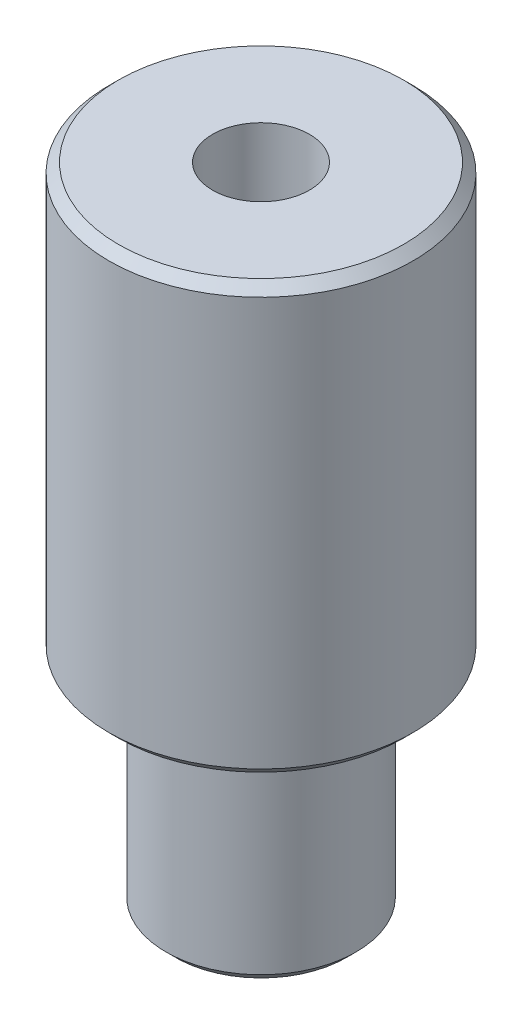
ISO-10303-21;
HEADER;
FILE_DESCRIPTION(('STEP AP214'),'2;1');
FILE_NAME('part.step','',(''),(''),'','','');
FILE_SCHEMA(('AUTOMOTIVE_DESIGN { 1 0 10303 214 1 1 1 1 }'));
ENDSEC;
DATA;
#1=APPLICATION_CONTEXT('core data for automotive mechanical design processes');
#2=APPLICATION_PROTOCOL_DEFINITION('international standard','automotive_design',2000,#1);
#3=PRODUCT_CONTEXT('',#1,'mechanical');
#4=PRODUCT('Part','Part','',(#3));
#5=PRODUCT_RELATED_PRODUCT_CATEGORY('part','',(#4));
#6=PRODUCT_DEFINITION_FORMATION('','',#4);
#7=PRODUCT_DEFINITION_CONTEXT('part definition',#1,'design');
#8=PRODUCT_DEFINITION('design','',#6,#7);
#9=PRODUCT_DEFINITION_SHAPE('','',#8);
#10=(LENGTH_UNIT() NAMED_UNIT(*) SI_UNIT(.MILLI.,.METRE.));
#11=(NAMED_UNIT(*) PLANE_ANGLE_UNIT() SI_UNIT($,.RADIAN.));
#12=(NAMED_UNIT(*) SI_UNIT($,.STERADIAN.) SOLID_ANGLE_UNIT());
#13=UNCERTAINTY_MEASURE_WITH_UNIT(LENGTH_MEASURE(1.E-05),#10,'distance_accuracy_value','');
#14=(GEOMETRIC_REPRESENTATION_CONTEXT(3) GLOBAL_UNCERTAINTY_ASSIGNED_CONTEXT((#13)) GLOBAL_UNIT_ASSIGNED_CONTEXT((#10,
#11,#12)) REPRESENTATION_CONTEXT('',''));
#15=CARTESIAN_POINT('',(0.,0.,0.));
#16=DIRECTION('',(0.,0.,1.));
#17=DIRECTION('',(1.,0.,0.));
#18=AXIS2_PLACEMENT_3D('',#15,#16,#17);
#19=CARTESIAN_POINT('',(0.,0.,0.));
#20=DIRECTION('',(0.,1.,0.));
#21=DIRECTION('',(0.,0.,1.));
#22=AXIS2_PLACEMENT_3D('',#19,#20,#21);
#23=PLANE('',#22);
#24=CARTESIAN_POINT('',(0.,0.,0.));
#25=DIRECTION('',(0.,1.,0.));
#26=DIRECTION('',(0.,0.,1.));
#27=AXIS2_PLACEMENT_3D('',#24,#25,#26);
#28=CIRCLE('',#27,5.1);
#29=CARTESIAN_POINT('',(0.,0.,5.1));
#30=VERTEX_POINT('',#29);
#31=EDGE_CURVE('E82',#30,#30,#28,.T.);
#32=ORIENTED_EDGE('',*,*,#31,.F.);
#33=EDGE_LOOP('',(#32));
#34=FACE_BOUND('',#33,.T.);
#35=CARTESIAN_POINT('',(0.,0.,0.));
#36=DIRECTION('',(0.,1.,0.));
#37=DIRECTION('',(0.,0.,1.));
#38=AXIS2_PLACEMENT_3D('',#35,#36,#37);
#39=CIRCLE('',#38,15.);
#40=CARTESIAN_POINT('',(0.,0.,15.));
#41=VERTEX_POINT('',#40);
#42=EDGE_CURVE('E10',#41,#41,#39,.T.);
#43=ORIENTED_EDGE('',*,*,#42,.T.);
#44=EDGE_LOOP('',(#43));
#45=FACE_BOUND('',#44,.T.);
#46=ADVANCED_FACE('F49',(#34,#45),#23,.T.);
#47=CARTESIAN_POINT('',(0.,-73.,0.));
#48=DIRECTION('',(0.,-1.,0.));
#49=DIRECTION('',(0.,0.,-1.));
#50=AXIS2_PLACEMENT_3D('',#47,#48,#49);
#51=CYLINDRICAL_SURFACE('',#50,16.);
#52=CARTESIAN_POINT('',(0.,-44.,0.));
#53=DIRECTION('',(0.,-1.,0.));
#54=DIRECTION('',(0.,0.,-1.));
#55=AXIS2_PLACEMENT_3D('',#52,#53,#54);
#56=CIRCLE('',#55,16.);
#57=CARTESIAN_POINT('',(0.,-44.,-16.));
#58=VERTEX_POINT('',#57);
#59=EDGE_CURVE('E57',#58,#58,#56,.F.);
#60=ORIENTED_EDGE('',*,*,#59,.T.);
#61=EDGE_LOOP('',(#60));
#62=FACE_BOUND('',#61,.T.);
#63=CARTESIAN_POINT('',(0.,-1.00000000000003,0.));
#64=DIRECTION('',(0.,1.,0.));
#65=DIRECTION('',(0.,0.,1.));
#66=AXIS2_PLACEMENT_3D('',#63,#64,#65);
#67=CIRCLE('',#66,16.);
#68=CARTESIAN_POINT('',(0.,-1.00000000000003,16.));
#69=VERTEX_POINT('',#68);
#70=EDGE_CURVE('E61',#69,#69,#67,.F.);
#71=ORIENTED_EDGE('',*,*,#70,.T.);
#72=EDGE_LOOP('',(#71));
#73=FACE_BOUND('',#72,.T.);
#74=ADVANCED_FACE('F89',(#62,#73),#51,.T.);
#75=CARTESIAN_POINT('',(16.,-45.,0.));
#76=DIRECTION('',(0.,-1.,0.));
#77=DIRECTION('',(0.,0.,-1.));
#78=AXIS2_PLACEMENT_3D('',#75,#76,#77);
#79=PLANE('',#78);
#80=CARTESIAN_POINT('',(0.,-45.,0.));
#81=DIRECTION('',(0.,-1.,0.));
#82=DIRECTION('',(0.,0.,-1.));
#83=AXIS2_PLACEMENT_3D('',#80,#81,#82);
#84=CIRCLE('',#83,15.);
#85=CARTESIAN_POINT('',(0.,-45.,-15.));
#86=VERTEX_POINT('',#85);
#87=EDGE_CURVE('E65',#86,#86,#84,.T.);
#88=ORIENTED_EDGE('',*,*,#87,.T.);
#89=EDGE_LOOP('',(#88));
#90=FACE_BOUND('',#89,.T.);
#91=CARTESIAN_POINT('',(0.,-45.,0.));
#92=DIRECTION('',(0.,-1.,0.));
#93=DIRECTION('',(0.,0.,-1.));
#94=AXIS2_PLACEMENT_3D('',#91,#92,#93);
#95=CIRCLE('',#94,10.);
#96=CARTESIAN_POINT('',(0.,-45.,-10.));
#97=VERTEX_POINT('',#96);
#98=EDGE_CURVE('E76',#97,#97,#95,.T.);
#99=ORIENTED_EDGE('',*,*,#98,.F.);
#100=EDGE_LOOP('',(#99));
#101=FACE_BOUND('',#100,.T.);
#102=ADVANCED_FACE('F96',(#90,#101),#79,.T.);
#103=CARTESIAN_POINT('',(0.,-73.,0.));
#104=DIRECTION('',(0.,-1.,0.));
#105=DIRECTION('',(0.,0.,-1.));
#106=AXIS2_PLACEMENT_3D('',#103,#104,#105);
#107=CYLINDRICAL_SURFACE('',#106,10.);
#108=CARTESIAN_POINT('',(0.,-67.,0.));
#109=DIRECTION('',(0.,-1.,0.));
#110=DIRECTION('',(0.,0.,-1.));
#111=AXIS2_PLACEMENT_3D('',#108,#109,#110);
#112=CIRCLE('',#111,10.);
#113=CARTESIAN_POINT('',(0.,-67.,-10.));
#114=VERTEX_POINT('',#113);
#115=EDGE_CURVE('E70',#114,#114,#112,.F.);
#116=ORIENTED_EDGE('',*,*,#115,.T.);
#117=EDGE_LOOP('',(#116));
#118=FACE_BOUND('',#117,.T.);
#119=ORIENTED_EDGE('',*,*,#98,.T.);
#120=EDGE_LOOP('',(#119));
#121=FACE_BOUND('',#120,.T.);
#122=ADVANCED_FACE('F122',(#118,#121),#107,.T.);
#123=CARTESIAN_POINT('',(10.,-68.,0.));
#124=DIRECTION('',(0.,-1.,0.));
#125=DIRECTION('',(0.,0.,-1.));
#126=AXIS2_PLACEMENT_3D('',#123,#124,#125);
#127=PLANE('',#126);
#128=CARTESIAN_POINT('',(0.,-68.,0.));
#129=DIRECTION('',(0.,1.,0.));
#130=DIRECTION('',(0.,0.,1.));
#131=AXIS2_PLACEMENT_3D('',#128,#129,#130);
#132=CIRCLE('',#131,5.09999999999998);
#133=CARTESIAN_POINT('',(0.,-68.,5.09999999999998));
#134=VERTEX_POINT('',#133);
#135=EDGE_CURVE('E79',#134,#134,#132,.T.);
#136=ORIENTED_EDGE('',*,*,#135,.T.);
#137=EDGE_LOOP('',(#136));
#138=FACE_BOUND('',#137,.T.);
#139=CARTESIAN_POINT('',(0.,-68.,0.));
#140=DIRECTION('',(0.,-1.,0.));
#141=DIRECTION('',(0.,0.,-1.));
#142=AXIS2_PLACEMENT_3D('',#139,#140,#141);
#143=CIRCLE('',#142,9.00000000000001);
#144=CARTESIAN_POINT('',(0.,-68.,-9.00000000000001));
#145=VERTEX_POINT('',#144);
#146=EDGE_CURVE('E73',#145,#145,#143,.T.);
#147=ORIENTED_EDGE('',*,*,#146,.T.);
#148=EDGE_LOOP('',(#147));
#149=FACE_BOUND('',#148,.T.);
#150=ADVANCED_FACE('F107',(#138,#149),#127,.T.);
#151=CARTESIAN_POINT('',(0.,-68.,0.));
#152=DIRECTION('',(0.,1.,0.));
#153=DIRECTION('',(0.,0.,1.));
#154=AXIS2_PLACEMENT_3D('',#151,#152,#153);
#155=CONICAL_SURFACE('',#154,9.00000000000001,0.785398163397444);
#156=ORIENTED_EDGE('',*,*,#115,.F.);
#157=EDGE_LOOP('',(#156));
#158=FACE_BOUND('',#157,.T.);
#159=ORIENTED_EDGE('',*,*,#146,.F.);
#160=EDGE_LOOP('',(#159));
#161=FACE_BOUND('',#160,.T.);
#162=ADVANCED_FACE('F101',(#158,#161),#155,.T.);
#163=CARTESIAN_POINT('',(0.,-45.,0.));
#164=DIRECTION('',(0.,1.,0.));
#165=DIRECTION('',(0.,0.,1.));
#166=AXIS2_PLACEMENT_3D('',#163,#164,#165);
#167=CONICAL_SURFACE('',#166,15.,0.785398163397443);
#168=ORIENTED_EDGE('',*,*,#59,.F.);
#169=EDGE_LOOP('',(#168));
#170=FACE_BOUND('',#169,.T.);
#171=ORIENTED_EDGE('',*,*,#87,.F.);
#172=EDGE_LOOP('',(#171));
#173=FACE_BOUND('',#172,.T.);
#174=ADVANCED_FACE('F106',(#170,#173),#167,.T.);
#175=CARTESIAN_POINT('',(0.,-1.00000000000003,0.));
#176=DIRECTION('',(0.,-1.,0.));
#177=DIRECTION('',(0.,0.,-1.));
#178=AXIS2_PLACEMENT_3D('',#175,#176,#177);
#179=CONICAL_SURFACE('',#178,16.,0.785398163397447);
#180=ORIENTED_EDGE('',*,*,#42,.F.);
#181=EDGE_LOOP('',(#180));
#182=FACE_BOUND('',#181,.T.);
#183=ORIENTED_EDGE('',*,*,#70,.F.);
#184=EDGE_LOOP('',(#183));
#185=FACE_BOUND('',#184,.T.);
#186=ADVANCED_FACE('F52',(#182,#185),#179,.T.);
#187=CARTESIAN_POINT('',(0.,0.,0.));
#188=DIRECTION('',(0.,1.,0.));
#189=DIRECTION('',(0.,0.,1.));
#190=AXIS2_PLACEMENT_3D('',#187,#188,#189);
#191=CYLINDRICAL_SURFACE('',#190,5.09999999999999);
#192=ORIENTED_EDGE('',*,*,#135,.F.);
#193=EDGE_LOOP('',(#192));
#194=FACE_BOUND('',#193,.T.);
#195=ORIENTED_EDGE('',*,*,#31,.T.);
#196=EDGE_LOOP('',(#195));
#197=FACE_BOUND('',#196,.T.);
#198=ADVANCED_FACE('F86',(#194,#197),#191,.F.);
#199=CLOSED_SHELL('',(#46,#74,#102,#122,#150,#162,#174,#186,#198));
#200=MANIFOLD_SOLID_BREP('B2',#199);
#201=ADVANCED_BREP_SHAPE_REPRESENTATION('',(#18,#200),#14);
#202=SHAPE_DEFINITION_REPRESENTATION(#9,#201);
ENDSEC;
END-ISO-10303-21;
